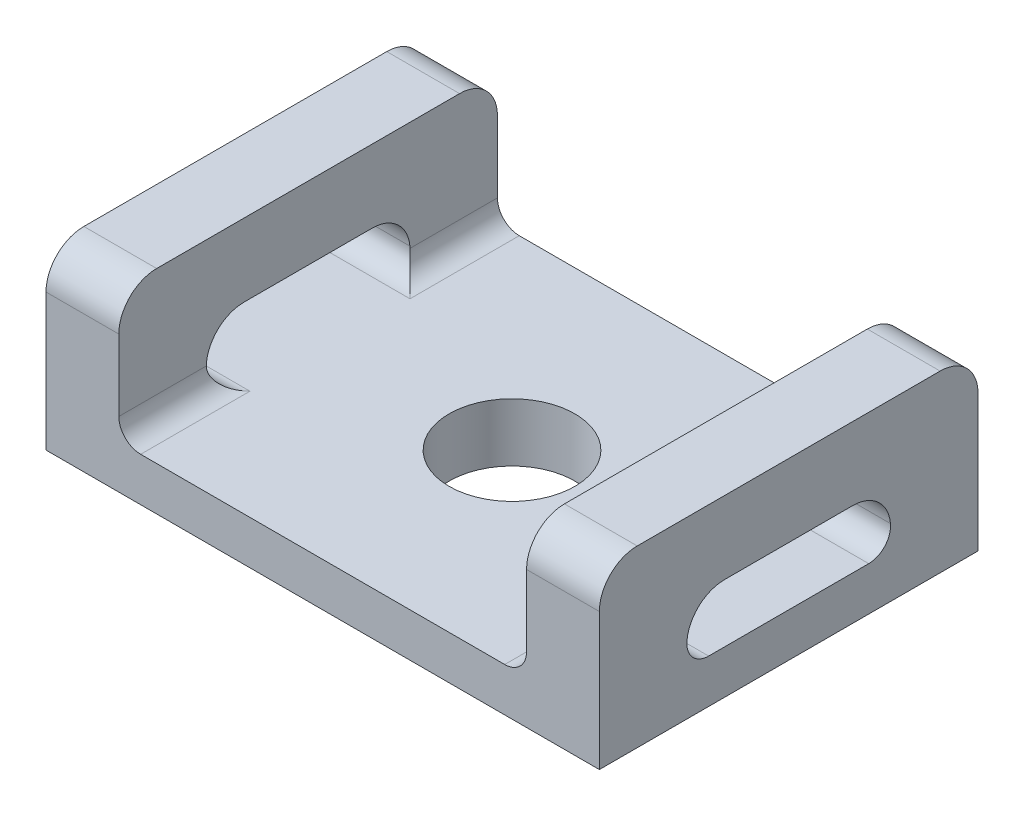
ISO-10303-21;
HEADER;
FILE_DESCRIPTION(('STEP AP214'),'2;1');
FILE_NAME('part.step','',(''),(''),'','','');
FILE_SCHEMA(('AUTOMOTIVE_DESIGN { 1 0 10303 214 1 1 1 1 }'));
ENDSEC;
DATA;
#1=APPLICATION_CONTEXT('core data for automotive mechanical design processes');
#2=APPLICATION_PROTOCOL_DEFINITION('international standard','automotive_design',2000,#1);
#3=PRODUCT_CONTEXT('',#1,'mechanical');
#4=PRODUCT('Part','Part','',(#3));
#5=PRODUCT_RELATED_PRODUCT_CATEGORY('part','',(#4));
#6=PRODUCT_DEFINITION_FORMATION('','',#4);
#7=PRODUCT_DEFINITION_CONTEXT('part definition',#1,'design');
#8=PRODUCT_DEFINITION('design','',#6,#7);
#9=PRODUCT_DEFINITION_SHAPE('','',#8);
#10=(LENGTH_UNIT() NAMED_UNIT(*) SI_UNIT(.MILLI.,.METRE.));
#11=(NAMED_UNIT(*) PLANE_ANGLE_UNIT() SI_UNIT($,.RADIAN.));
#12=(NAMED_UNIT(*) SI_UNIT($,.STERADIAN.) SOLID_ANGLE_UNIT());
#13=UNCERTAINTY_MEASURE_WITH_UNIT(LENGTH_MEASURE(1.E-05),#10,'distance_accuracy_value','');
#14=(GEOMETRIC_REPRESENTATION_CONTEXT(3) GLOBAL_UNCERTAINTY_ASSIGNED_CONTEXT((#13)) GLOBAL_UNIT_ASSIGNED_CONTEXT((#10,
#11,#12)) REPRESENTATION_CONTEXT('',''));
#15=CARTESIAN_POINT('',(0.,0.,0.));
#16=DIRECTION('',(0.,0.,1.));
#17=DIRECTION('',(1.,0.,0.));
#18=AXIS2_PLACEMENT_3D('',#15,#16,#17);
#19=CARTESIAN_POINT('',(-9.5,5.2,5.2));
#20=DIRECTION('',(1.,0.,0.));
#21=DIRECTION('',(0.,0.,-1.));
#22=AXIS2_PLACEMENT_3D('',#19,#20,#21);
#23=CYLINDRICAL_SURFACE('',#22,1.3);
#24=DIRECTION('',(1.,0.,0.));
#25=VECTOR('',#24,1.);
#26=CARTESIAN_POINT('',(-9.5,5.2,6.5));
#27=LINE('',#26,#25);
#28=CARTESIAN_POINT('',(-9.5,5.2,6.5));
#29=VERTEX_POINT('',#28);
#30=CARTESIAN_POINT('',(-7.,5.2,6.5));
#31=VERTEX_POINT('',#30);
#32=EDGE_CURVE('E298',#29,#31,#27,.T.);
#33=ORIENTED_EDGE('',*,*,#32,.T.);
#34=CARTESIAN_POINT('',(-7.,5.2,5.2));
#35=DIRECTION('',(-1.,0.,0.));
#36=DIRECTION('',(0.,-1.,0.));
#37=AXIS2_PLACEMENT_3D('',#34,#35,#36);
#38=CIRCLE('',#37,1.3);
#39=CARTESIAN_POINT('',(-7.,6.5,5.2));
#40=VERTEX_POINT('',#39);
#41=EDGE_CURVE('E516',#31,#40,#38,.T.);
#42=ORIENTED_EDGE('',*,*,#41,.T.);
#43=DIRECTION('',(1.,0.,0.));
#44=VECTOR('',#43,1.);
#45=CARTESIAN_POINT('',(-9.5,6.5,5.2));
#46=LINE('',#45,#44);
#47=CARTESIAN_POINT('',(-9.5,6.5,5.2));
#48=VERTEX_POINT('',#47);
#49=EDGE_CURVE('E312',#48,#40,#46,.T.);
#50=ORIENTED_EDGE('',*,*,#49,.F.);
#51=CARTESIAN_POINT('',(-9.5,5.2,5.2));
#52=DIRECTION('',(1.,0.,0.));
#53=DIRECTION('',(0.,0.,-1.));
#54=AXIS2_PLACEMENT_3D('',#51,#52,#53);
#55=CIRCLE('',#54,1.3);
#56=EDGE_CURVE('E503',#29,#48,#55,.F.);
#57=ORIENTED_EDGE('',*,*,#56,.F.);
#58=EDGE_LOOP('',(#33,#42,#50,#57));
#59=FACE_BOUND('',#58,.T.);
#60=ADVANCED_FACE('F49',(#59),#23,.T.);
#61=CARTESIAN_POINT('',(-9.5,6.5,0.));
#62=DIRECTION('',(0.,-1.,0.));
#63=DIRECTION('',(0.,0.,-1.));
#64=AXIS2_PLACEMENT_3D('',#61,#62,#63);
#65=PLANE('',#64);
#66=ORIENTED_EDGE('',*,*,#49,.T.);
#67=DIRECTION('',(0.,0.,-1.));
#68=VECTOR('',#67,1.);
#69=CARTESIAN_POINT('',(-7.,6.5,0.));
#70=LINE('',#69,#68);
#71=CARTESIAN_POINT('',(-7.,6.5,-5.2));
#72=VERTEX_POINT('',#71);
#73=EDGE_CURVE('E561',#40,#72,#70,.T.);
#74=ORIENTED_EDGE('',*,*,#73,.T.);
#75=DIRECTION('',(1.,0.,0.));
#76=VECTOR('',#75,1.);
#77=CARTESIAN_POINT('',(-9.5,6.5,-5.2));
#78=LINE('',#77,#76);
#79=CARTESIAN_POINT('',(-9.5,6.5,-5.2));
#80=VERTEX_POINT('',#79);
#81=EDGE_CURVE('E290',#80,#72,#78,.T.);
#82=ORIENTED_EDGE('',*,*,#81,.F.);
#83=DIRECTION('',(0.,0.,-1.));
#84=VECTOR('',#83,1.);
#85=CARTESIAN_POINT('',(-9.5,6.5,0.));
#86=LINE('',#85,#84);
#87=EDGE_CURVE('E506',#48,#80,#86,.T.);
#88=ORIENTED_EDGE('',*,*,#87,.F.);
#89=EDGE_LOOP('',(#66,#74,#82,#88));
#90=FACE_BOUND('',#89,.T.);
#91=ADVANCED_FACE('F655',(#90),#65,.F.);
#92=CARTESIAN_POINT('',(-9.5,5.2,-5.2));
#93=DIRECTION('',(1.,0.,0.));
#94=DIRECTION('',(0.,0.,-1.));
#95=AXIS2_PLACEMENT_3D('',#92,#93,#94);
#96=CYLINDRICAL_SURFACE('',#95,1.3);
#97=ORIENTED_EDGE('',*,*,#81,.T.);
#98=CARTESIAN_POINT('',(-7.,5.2,-5.2));
#99=DIRECTION('',(-1.,0.,0.));
#100=DIRECTION('',(0.,-1.,0.));
#101=AXIS2_PLACEMENT_3D('',#98,#99,#100);
#102=CIRCLE('',#101,1.3);
#103=CARTESIAN_POINT('',(-7.,5.2,-6.5));
#104=VERTEX_POINT('',#103);
#105=EDGE_CURVE('E564',#72,#104,#102,.T.);
#106=ORIENTED_EDGE('',*,*,#105,.T.);
#107=DIRECTION('',(1.,0.,0.));
#108=VECTOR('',#107,1.);
#109=CARTESIAN_POINT('',(-9.5,5.2,-6.5));
#110=LINE('',#109,#108);
#111=CARTESIAN_POINT('',(-9.5,5.2,-6.5));
#112=VERTEX_POINT('',#111);
#113=EDGE_CURVE('E279',#112,#104,#110,.T.);
#114=ORIENTED_EDGE('',*,*,#113,.F.);
#115=CARTESIAN_POINT('',(-9.5,5.2,-5.2));
#116=DIRECTION('',(1.,0.,0.));
#117=DIRECTION('',(0.,0.,-1.));
#118=AXIS2_PLACEMENT_3D('',#115,#116,#117);
#119=CIRCLE('',#118,1.3);
#120=EDGE_CURVE('E544',#80,#112,#119,.F.);
#121=ORIENTED_EDGE('',*,*,#120,.F.);
#122=EDGE_LOOP('',(#97,#106,#114,#121));
#123=FACE_BOUND('',#122,.T.);
#124=ADVANCED_FACE('F654',(#123),#96,.T.);
#125=CARTESIAN_POINT('',(-9.5,2.7,-2.2));
#126=DIRECTION('',(1.,0.,0.));
#127=DIRECTION('',(0.,0.,-1.));
#128=AXIS2_PLACEMENT_3D('',#125,#126,#127);
#129=CYLINDRICAL_SURFACE('',#128,1.3);
#130=CARTESIAN_POINT('',(-9.5,2.7,-2.2));
#131=DIRECTION('',(1.,0.,0.));
#132=DIRECTION('',(0.,0.,-1.));
#133=AXIS2_PLACEMENT_3D('',#130,#131,#132);
#134=CIRCLE('',#133,1.3);
#135=CARTESIAN_POINT('',(-9.5,2.81818181818182,-3.49461695410312));
#136=VERTEX_POINT('',#135);
#137=CARTESIAN_POINT('',(-9.5,4.,-2.2));
#138=VERTEX_POINT('',#137);
#139=EDGE_CURVE('E547',#136,#138,#134,.T.);
#140=ORIENTED_EDGE('',*,*,#139,.F.);
#141=DIRECTION('',(1.,0.,0.));
#142=VECTOR('',#141,1.);
#143=CARTESIAN_POINT('',(-9.5,2.81818181818182,-3.49461695410312));
#144=LINE('',#143,#142);
#145=CARTESIAN_POINT('',(-6.99999999999999,2.81818181818182,-3.49461695410312));
#146=VERTEX_POINT('',#145);
#147=EDGE_CURVE('E381',#136,#146,#144,.T.);
#148=ORIENTED_EDGE('',*,*,#147,.T.);
#149=CARTESIAN_POINT('',(-6.99999999999999,2.7,-2.2));
#150=DIRECTION('',(-1.,0.,0.));
#151=DIRECTION('',(0.,-1.,0.));
#152=AXIS2_PLACEMENT_3D('',#149,#150,#151);
#153=CIRCLE('',#152,1.3);
#154=CARTESIAN_POINT('',(-7.,4.,-2.2));
#155=VERTEX_POINT('',#154);
#156=EDGE_CURVE('E568',#146,#155,#153,.F.);
#157=ORIENTED_EDGE('',*,*,#156,.T.);
#158=DIRECTION('',(1.,0.,0.));
#159=VECTOR('',#158,1.);
#160=CARTESIAN_POINT('',(-9.5,4.,-2.2));
#161=LINE('',#160,#159);
#162=EDGE_CURVE('E280',#138,#155,#161,.T.);
#163=ORIENTED_EDGE('',*,*,#162,.F.);
#164=EDGE_LOOP('',(#140,#148,#157,#163));
#165=FACE_BOUND('',#164,.T.);
#166=ADVANCED_FACE('F686',(#165),#129,.F.);
#167=CARTESIAN_POINT('',(-9.5,4.,0.));
#168=DIRECTION('',(0.,-1.,0.));
#169=DIRECTION('',(0.,0.,-1.));
#170=AXIS2_PLACEMENT_3D('',#167,#168,#169);
#171=PLANE('',#170);
#172=DIRECTION('',(0.,0.,-1.));
#173=VECTOR('',#172,1.);
#174=CARTESIAN_POINT('',(-7.,4.,0.));
#175=LINE('',#174,#173);
#176=CARTESIAN_POINT('',(-6.99999999999999,4.,2.2));
#177=VERTEX_POINT('',#176);
#178=EDGE_CURVE('E571',#177,#155,#175,.T.);
#179=ORIENTED_EDGE('',*,*,#178,.F.);
#180=DIRECTION('',(1.,0.,0.));
#181=VECTOR('',#180,1.);
#182=CARTESIAN_POINT('',(-9.5,4.,2.2));
#183=LINE('',#182,#181);
#184=CARTESIAN_POINT('',(-9.5,4.,2.2));
#185=VERTEX_POINT('',#184);
#186=EDGE_CURVE('E293',#185,#177,#183,.T.);
#187=ORIENTED_EDGE('',*,*,#186,.F.);
#188=DIRECTION('',(0.,0.,-1.));
#189=VECTOR('',#188,1.);
#190=CARTESIAN_POINT('',(-9.5,4.,0.));
#191=LINE('',#190,#189);
#192=EDGE_CURVE('E550',#185,#138,#191,.T.);
#193=ORIENTED_EDGE('',*,*,#192,.T.);
#194=ORIENTED_EDGE('',*,*,#162,.T.);
#195=EDGE_LOOP('',(#179,#187,#193,#194));
#196=FACE_BOUND('',#195,.T.);
#197=ADVANCED_FACE('F675',(#196),#171,.T.);
#198=CARTESIAN_POINT('',(-9.5,2.7,2.2));
#199=DIRECTION('',(1.,0.,0.));
#200=DIRECTION('',(0.,0.,-1.));
#201=AXIS2_PLACEMENT_3D('',#198,#199,#200);
#202=CYLINDRICAL_SURFACE('',#201,1.3);
#203=CARTESIAN_POINT('',(-6.99999999999999,2.7,2.2));
#204=DIRECTION('',(-1.,0.,0.));
#205=DIRECTION('',(0.,-1.,0.));
#206=AXIS2_PLACEMENT_3D('',#203,#204,#205);
#207=CIRCLE('',#206,1.3);
#208=CARTESIAN_POINT('',(-6.99999999999999,2.81818181818182,3.49461695410312));
#209=VERTEX_POINT('',#208);
#210=EDGE_CURVE('E575',#177,#209,#207,.F.);
#211=ORIENTED_EDGE('',*,*,#210,.T.);
#212=DIRECTION('',(1.,0.,0.));
#213=VECTOR('',#212,1.);
#214=CARTESIAN_POINT('',(-9.5,2.81818181818182,3.49461695410312));
#215=LINE('',#214,#213);
#216=CARTESIAN_POINT('',(-9.5,2.81818181818182,3.49461695410312));
#217=VERTEX_POINT('',#216);
#218=EDGE_CURVE('E366',#209,#217,#215,.F.);
#219=ORIENTED_EDGE('',*,*,#218,.T.);
#220=CARTESIAN_POINT('',(-9.5,2.7,2.2));
#221=DIRECTION('',(1.,0.,0.));
#222=DIRECTION('',(0.,0.,-1.));
#223=AXIS2_PLACEMENT_3D('',#220,#221,#222);
#224=CIRCLE('',#223,1.3);
#225=EDGE_CURVE('E510',#185,#217,#224,.T.);
#226=ORIENTED_EDGE('',*,*,#225,.F.);
#227=ORIENTED_EDGE('',*,*,#186,.T.);
#228=EDGE_LOOP('',(#211,#219,#226,#227));
#229=FACE_BOUND('',#228,.T.);
#230=ADVANCED_FACE('F671',(#229),#202,.F.);
#231=CARTESIAN_POINT('',(0.,2.,0.));
#232=DIRECTION('',(0.,-1.,0.));
#233=DIRECTION('',(0.,0.,-1.));
#234=AXIS2_PLACEMENT_3D('',#231,#232,#233);
#235=PLANE('',#234);
#236=DIRECTION('',(-1.,0.,0.));
#237=VECTOR('',#236,1.);
#238=CARTESIAN_POINT('',(-6.99999999999999,2.,2.74772255750517));
#239=LINE('',#238,#237);
#240=CARTESIAN_POINT('',(-9.5,2.,2.74772255750517));
#241=VERTEX_POINT('',#240);
#242=CARTESIAN_POINT('',(-6.25,2.,2.74772255750517));
#243=VERTEX_POINT('',#242);
#244=EDGE_CURVE('E353',#241,#243,#239,.F.);
#245=ORIENTED_EDGE('',*,*,#244,.T.);
#246=DIRECTION('',(0.,0.,1.));
#247=VECTOR('',#246,1.);
#248=CARTESIAN_POINT('',(-6.25,2.,6.5));
#249=LINE('',#248,#247);
#250=CARTESIAN_POINT('',(-6.25,2.,6.5));
#251=VERTEX_POINT('',#250);
#252=EDGE_CURVE('E356',#243,#251,#249,.T.);
#253=ORIENTED_EDGE('',*,*,#252,.T.);
#254=DIRECTION('',(-1.,0.,0.));
#255=VECTOR('',#254,1.);
#256=CARTESIAN_POINT('',(-9.5,2.,6.5));
#257=LINE('',#256,#255);
#258=CARTESIAN_POINT('',(6.25,2.,6.5));
#259=VERTEX_POINT('',#258);
#260=EDGE_CURVE('E260',#259,#251,#257,.T.);
#261=ORIENTED_EDGE('',*,*,#260,.F.);
#262=DIRECTION('',(0.,0.,1.));
#263=VECTOR('',#262,1.);
#264=CARTESIAN_POINT('',(6.25,2.,3.5));
#265=LINE('',#264,#263);
#266=CARTESIAN_POINT('',(6.25,2.,2.74772255750517));
#267=VERTEX_POINT('',#266);
#268=EDGE_CURVE('E346',#259,#267,#265,.F.);
#269=ORIENTED_EDGE('',*,*,#268,.T.);
#270=DIRECTION('',(-1.,0.,0.));
#271=VECTOR('',#270,1.);
#272=CARTESIAN_POINT('',(9.5,2.,2.74772255750517));
#273=LINE('',#272,#271);
#274=CARTESIAN_POINT('',(9.5,2.,2.74772255750517));
#275=VERTEX_POINT('',#274);
#276=EDGE_CURVE('E349',#267,#275,#273,.F.);
#277=ORIENTED_EDGE('',*,*,#276,.T.);
#278=DIRECTION('',(0.,0.,-1.));
#279=VECTOR('',#278,1.);
#280=CARTESIAN_POINT('',(9.5,2.,6.5));
#281=LINE('',#280,#279);
#282=CARTESIAN_POINT('',(9.5,2.,-2.74772255750516));
#283=VERTEX_POINT('',#282);
#284=EDGE_CURVE('E307',#275,#283,#281,.T.);
#285=ORIENTED_EDGE('',*,*,#284,.T.);
#286=DIRECTION('',(-1.,0.,0.));
#287=VECTOR('',#286,1.);
#288=CARTESIAN_POINT('',(7.,2.,-2.74772255750516));
#289=LINE('',#288,#287);
#290=CARTESIAN_POINT('',(6.25,2.,-2.74772255750516));
#291=VERTEX_POINT('',#290);
#292=EDGE_CURVE('E340',#283,#291,#289,.T.);
#293=ORIENTED_EDGE('',*,*,#292,.T.);
#294=DIRECTION('',(0.,0.,1.));
#295=VECTOR('',#294,1.);
#296=CARTESIAN_POINT('',(6.25,2.,-6.5));
#297=LINE('',#296,#295);
#298=CARTESIAN_POINT('',(6.25,2.,-6.5));
#299=VERTEX_POINT('',#298);
#300=EDGE_CURVE('E343',#291,#299,#297,.F.);
#301=ORIENTED_EDGE('',*,*,#300,.T.);
#302=DIRECTION('',(1.,0.,0.));
#303=VECTOR('',#302,1.);
#304=CARTESIAN_POINT('',(-6.99999999999999,2.,-6.5));
#305=LINE('',#304,#303);
#306=CARTESIAN_POINT('',(-6.25,2.,-6.5));
#307=VERTEX_POINT('',#306);
#308=EDGE_CURVE('E261',#307,#299,#305,.T.);
#309=ORIENTED_EDGE('',*,*,#308,.F.);
#310=DIRECTION('',(0.,0.,1.));
#311=VECTOR('',#310,1.);
#312=CARTESIAN_POINT('',(-6.25,2.,-3.5));
#313=LINE('',#312,#311);
#314=CARTESIAN_POINT('',(-6.25,2.,-2.74772255750516));
#315=VERTEX_POINT('',#314);
#316=EDGE_CURVE('E336',#307,#315,#313,.T.);
#317=ORIENTED_EDGE('',*,*,#316,.T.);
#318=DIRECTION('',(-1.,0.,0.));
#319=VECTOR('',#318,1.);
#320=CARTESIAN_POINT('',(-9.5,2.,-2.74772255750516));
#321=LINE('',#320,#319);
#322=CARTESIAN_POINT('',(-9.5,2.,-2.74772255750516));
#323=VERTEX_POINT('',#322);
#324=EDGE_CURVE('E333',#315,#323,#321,.T.);
#325=ORIENTED_EDGE('',*,*,#324,.T.);
#326=DIRECTION('',(0.,0.,1.));
#327=VECTOR('',#326,1.);
#328=CARTESIAN_POINT('',(-9.5,2.,6.5));
#329=LINE('',#328,#327);
#330=EDGE_CURVE('E316',#323,#241,#329,.T.);
#331=ORIENTED_EDGE('',*,*,#330,.T.);
#332=EDGE_LOOP('',(#245,#253,#261,#269,#277,#285,#293,#301,#309,#317,#325,#331));
#333=FACE_BOUND('',#332,.T.);
#334=CARTESIAN_POINT('',(0.,2.,0.));
#335=DIRECTION('',(0.,1.,0.));
#336=DIRECTION('',(0.,0.,1.));
#337=AXIS2_PLACEMENT_3D('',#334,#335,#336);
#338=CIRCLE('',#337,2.159);
#339=CARTESIAN_POINT('',(0.,2.,2.159));
#340=VERTEX_POINT('',#339);
#341=EDGE_CURVE('E303',#340,#340,#338,.T.);
#342=ORIENTED_EDGE('',*,*,#341,.F.);
#343=EDGE_LOOP('',(#342));
#344=FACE_BOUND('',#343,.T.);
#345=ADVANCED_FACE('F615',(#333,#344),#235,.F.);
#346=CARTESIAN_POINT('',(0.,0.,0.));
#347=DIRECTION('',(0.,-1.,0.));
#348=DIRECTION('',(0.,0.,-1.));
#349=AXIS2_PLACEMENT_3D('',#346,#347,#348);
#350=PLANE('',#349);
#351=DIRECTION('',(1.,0.,0.));
#352=VECTOR('',#351,1.);
#353=CARTESIAN_POINT('',(9.5,0.,-6.));
#354=LINE('',#353,#352);
#355=CARTESIAN_POINT('',(-8.99999999999999,0.,-6.));
#356=VERTEX_POINT('',#355);
#357=CARTESIAN_POINT('',(9.,0.,-6.));
#358=VERTEX_POINT('',#357);
#359=EDGE_CURVE('E440',#356,#358,#354,.T.);
#360=ORIENTED_EDGE('',*,*,#359,.T.);
#361=DIRECTION('',(0.,0.,1.));
#362=VECTOR('',#361,1.);
#363=CARTESIAN_POINT('',(9.,0.,6.5));
#364=LINE('',#363,#362);
#365=CARTESIAN_POINT('',(9.,0.,6.));
#366=VERTEX_POINT('',#365);
#367=EDGE_CURVE('E449',#358,#366,#364,.T.);
#368=ORIENTED_EDGE('',*,*,#367,.T.);
#369=DIRECTION('',(-1.,0.,0.));
#370=VECTOR('',#369,1.);
#371=CARTESIAN_POINT('',(-9.5,0.,6.));
#372=LINE('',#371,#370);
#373=CARTESIAN_POINT('',(-8.99999999999999,0.,6.));
#374=VERTEX_POINT('',#373);
#375=EDGE_CURVE('E446',#366,#374,#372,.T.);
#376=ORIENTED_EDGE('',*,*,#375,.T.);
#377=DIRECTION('',(0.,0.,-1.));
#378=VECTOR('',#377,1.);
#379=CARTESIAN_POINT('',(-8.99999999999999,0.,-6.5));
#380=LINE('',#379,#378);
#381=EDGE_CURVE('E443',#374,#356,#380,.T.);
#382=ORIENTED_EDGE('',*,*,#381,.T.);
#383=EDGE_LOOP('',(#360,#368,#376,#382));
#384=FACE_BOUND('',#383,.T.);
#385=CARTESIAN_POINT('',(0.,0.,0.));
#386=DIRECTION('',(0.,1.,0.));
#387=DIRECTION('',(0.,0.,1.));
#388=AXIS2_PLACEMENT_3D('',#385,#386,#387);
#389=CIRCLE('',#388,2.159);
#390=CARTESIAN_POINT('',(0.,0.,2.159));
#391=VERTEX_POINT('',#390);
#392=EDGE_CURVE('E308',#391,#391,#389,.T.);
#393=ORIENTED_EDGE('',*,*,#392,.T.);
#394=EDGE_LOOP('',(#393));
#395=FACE_BOUND('',#394,.T.);
#396=ADVANCED_FACE('F480',(#384,#395),#350,.T.);
#397=CARTESIAN_POINT('',(9.5,2.,6.5));
#398=DIRECTION('',(-1.,0.,0.));
#399=DIRECTION('',(0.,0.,1.));
#400=AXIS2_PLACEMENT_3D('',#397,#398,#399);
#401=PLANE('',#400);
#402=CARTESIAN_POINT('',(9.5,2.7,-2.2));
#403=DIRECTION('',(1.,0.,0.));
#404=DIRECTION('',(0.,0.,-1.));
#405=AXIS2_PLACEMENT_3D('',#402,#403,#404);
#406=CIRCLE('',#405,1.3);
#407=CARTESIAN_POINT('',(9.5,2.81818181818182,-3.49461695410312));
#408=VERTEX_POINT('',#407);
#409=CARTESIAN_POINT('',(9.5,4.,-2.2));
#410=VERTEX_POINT('',#409);
#411=EDGE_CURVE('E528',#408,#410,#406,.T.);
#412=ORIENTED_EDGE('',*,*,#411,.F.);
#413=CARTESIAN_POINT('',(9.5,2.75,-2.74772255750516));
#414=DIRECTION('',(-1.,0.,0.));
#415=DIRECTION('',(0.,0.,1.));
#416=AXIS2_PLACEMENT_3D('',#413,#414,#415);
#417=CIRCLE('',#416,0.75);
#418=EDGE_CURVE('E404',#408,#283,#417,.T.);
#419=ORIENTED_EDGE('',*,*,#418,.T.);
#420=ORIENTED_EDGE('',*,*,#284,.F.);
#421=CARTESIAN_POINT('',(9.5,2.75,2.74772255750517));
#422=DIRECTION('',(-1.,0.,0.));
#423=DIRECTION('',(0.,0.,1.));
#424=AXIS2_PLACEMENT_3D('',#421,#422,#423);
#425=CIRCLE('',#424,0.75);
#426=CARTESIAN_POINT('',(9.5,2.81818181818182,3.49461695410312));
#427=VERTEX_POINT('',#426);
#428=EDGE_CURVE('E393',#275,#427,#425,.T.);
#429=ORIENTED_EDGE('',*,*,#428,.T.);
#430=CARTESIAN_POINT('',(9.5,2.7,2.2));
#431=DIRECTION('',(1.,0.,0.));
#432=DIRECTION('',(0.,0.,-1.));
#433=AXIS2_PLACEMENT_3D('',#430,#431,#432);
#434=CIRCLE('',#433,1.3);
#435=CARTESIAN_POINT('',(9.5,4.,2.2));
#436=VERTEX_POINT('',#435);
#437=EDGE_CURVE('E535',#436,#427,#434,.T.);
#438=ORIENTED_EDGE('',*,*,#437,.F.);
#439=DIRECTION('',(0.,0.,-1.));
#440=VECTOR('',#439,1.);
#441=CARTESIAN_POINT('',(9.5,4.,0.));
#442=LINE('',#441,#440);
#443=EDGE_CURVE('E531',#436,#410,#442,.T.);
#444=ORIENTED_EDGE('',*,*,#443,.T.);
#445=EDGE_LOOP('',(#412,#419,#420,#429,#438,#444));
#446=FACE_BOUND('',#445,.T.);
#447=DIRECTION('',(0.,-1.,0.));
#448=VECTOR('',#447,1.);
#449=CARTESIAN_POINT('',(9.5,2.,6.5));
#450=LINE('',#449,#448);
#451=CARTESIAN_POINT('',(9.5,5.2,6.5));
#452=VERTEX_POINT('',#451);
#453=CARTESIAN_POINT('',(9.5,0.500000000000004,6.5));
#454=VERTEX_POINT('',#453);
#455=EDGE_CURVE('E320',#452,#454,#450,.T.);
#456=ORIENTED_EDGE('',*,*,#455,.T.);
#457=DIRECTION('',(0.,0.,-1.));
#458=VECTOR('',#457,1.);
#459=CARTESIAN_POINT('',(9.5,0.500000000000004,-6.5));
#460=LINE('',#459,#458);
#461=CARTESIAN_POINT('',(9.5,0.500000000000004,-6.5));
#462=VERTEX_POINT('',#461);
#463=EDGE_CURVE('E420',#454,#462,#460,.T.);
#464=ORIENTED_EDGE('',*,*,#463,.T.);
#465=DIRECTION('',(0.,-1.,0.));
#466=VECTOR('',#465,1.);
#467=CARTESIAN_POINT('',(9.5,2.,-6.5));
#468=LINE('',#467,#466);
#469=CARTESIAN_POINT('',(9.5,5.2,-6.5));
#470=VERTEX_POINT('',#469);
#471=EDGE_CURVE('E330',#470,#462,#468,.T.);
#472=ORIENTED_EDGE('',*,*,#471,.F.);
#473=CARTESIAN_POINT('',(9.5,5.2,-5.2));
#474=DIRECTION('',(1.,0.,0.));
#475=DIRECTION('',(0.,0.,-1.));
#476=AXIS2_PLACEMENT_3D('',#473,#474,#475);
#477=CIRCLE('',#476,1.3);
#478=CARTESIAN_POINT('',(9.5,6.5,-5.2));
#479=VERTEX_POINT('',#478);
#480=EDGE_CURVE('E277',#479,#470,#477,.F.);
#481=ORIENTED_EDGE('',*,*,#480,.F.);
#482=DIRECTION('',(0.,0.,-1.));
#483=VECTOR('',#482,1.);
#484=CARTESIAN_POINT('',(9.5,6.5,0.));
#485=LINE('',#484,#483);
#486=CARTESIAN_POINT('',(9.5,6.5,5.2));
#487=VERTEX_POINT('',#486);
#488=EDGE_CURVE('E511',#487,#479,#485,.T.);
#489=ORIENTED_EDGE('',*,*,#488,.F.);
#490=CARTESIAN_POINT('',(9.5,5.2,5.2));
#491=DIRECTION('',(1.,0.,0.));
#492=DIRECTION('',(0.,0.,-1.));
#493=AXIS2_PLACEMENT_3D('',#490,#491,#492);
#494=CIRCLE('',#493,1.3);
#495=EDGE_CURVE('E494',#452,#487,#494,.F.);
#496=ORIENTED_EDGE('',*,*,#495,.F.);
#497=EDGE_LOOP('',(#456,#464,#472,#481,#489,#496));
#498=FACE_BOUND('',#497,.T.);
#499=ADVANCED_FACE('F489',(#446,#498),#401,.F.);
#500=CARTESIAN_POINT('',(-9.5,2.,-6.5));
#501=DIRECTION('',(0.,0.,1.));
#502=DIRECTION('',(1.,0.,0.));
#503=AXIS2_PLACEMENT_3D('',#500,#501,#502);
#504=PLANE('',#503);
#505=ORIENTED_EDGE('',*,*,#471,.T.);
#506=DIRECTION('',(-1.,0.,0.));
#507=VECTOR('',#506,1.);
#508=CARTESIAN_POINT('',(-9.5,0.500000000000004,-6.5));
#509=LINE('',#508,#507);
#510=CARTESIAN_POINT('',(-9.5,0.500000000000004,-6.5));
#511=VERTEX_POINT('',#510);
#512=EDGE_CURVE('E11',#462,#511,#509,.T.);
#513=ORIENTED_EDGE('',*,*,#512,.T.);
#514=DIRECTION('',(0.,-1.,0.));
#515=VECTOR('',#514,1.);
#516=CARTESIAN_POINT('',(-9.5,2.,-6.5));
#517=LINE('',#516,#515);
#518=EDGE_CURVE('E327',#112,#511,#517,.T.);
#519=ORIENTED_EDGE('',*,*,#518,.F.);
#520=ORIENTED_EDGE('',*,*,#113,.T.);
#521=DIRECTION('',(0.,-1.,0.));
#522=VECTOR('',#521,1.);
#523=CARTESIAN_POINT('',(-7.,7.,-6.5));
#524=LINE('',#523,#522);
#525=CARTESIAN_POINT('',(-6.99999999999999,2.75,-6.5));
#526=VERTEX_POINT('',#525);
#527=EDGE_CURVE('E425',#104,#526,#524,.T.);
#528=ORIENTED_EDGE('',*,*,#527,.T.);
#529=CARTESIAN_POINT('',(-6.25,2.75,-6.5));
#530=DIRECTION('',(0.,0.,1.));
#531=DIRECTION('',(1.,0.,0.));
#532=AXIS2_PLACEMENT_3D('',#529,#530,#531);
#533=CIRCLE('',#532,0.75);
#534=EDGE_CURVE('E410',#526,#307,#533,.T.);
#535=ORIENTED_EDGE('',*,*,#534,.T.);
#536=ORIENTED_EDGE('',*,*,#308,.T.);
#537=CARTESIAN_POINT('',(6.25,2.75,-6.5));
#538=DIRECTION('',(0.,0.,1.));
#539=DIRECTION('',(1.,0.,0.));
#540=AXIS2_PLACEMENT_3D('',#537,#538,#539);
#541=CIRCLE('',#540,0.75);
#542=CARTESIAN_POINT('',(7.,2.75,-6.5));
#543=VERTEX_POINT('',#542);
#544=EDGE_CURVE('E256',#299,#543,#541,.T.);
#545=ORIENTED_EDGE('',*,*,#544,.T.);
#546=DIRECTION('',(0.,1.,0.));
#547=VECTOR('',#546,1.);
#548=CARTESIAN_POINT('',(7.,7.,-6.5));
#549=LINE('',#548,#547);
#550=CARTESIAN_POINT('',(7.,5.2,-6.5));
#551=VERTEX_POINT('',#550);
#552=EDGE_CURVE('E248',#543,#551,#549,.T.);
#553=ORIENTED_EDGE('',*,*,#552,.T.);
#554=EDGE_CURVE('E252',#551,#470,#110,.T.);
#555=ORIENTED_EDGE('',*,*,#554,.T.);
#556=EDGE_LOOP('',(#505,#513,#519,#520,#528,#535,#536,#545,#553,#555));
#557=FACE_BOUND('',#556,.T.);
#558=ADVANCED_FACE('F250',(#557),#504,.F.);
#559=CARTESIAN_POINT('',(-9.5,2.,6.5));
#560=DIRECTION('',(1.,0.,0.));
#561=DIRECTION('',(0.,0.,-1.));
#562=AXIS2_PLACEMENT_3D('',#559,#560,#561);
#563=PLANE('',#562);
#564=ORIENTED_EDGE('',*,*,#330,.F.);
#565=CARTESIAN_POINT('',(-9.5,2.75,-2.74772255750516));
#566=DIRECTION('',(1.,0.,0.));
#567=DIRECTION('',(0.,0.,-1.));
#568=AXIS2_PLACEMENT_3D('',#565,#566,#567);
#569=CIRCLE('',#568,0.75);
#570=EDGE_CURVE('E417',#323,#136,#569,.T.);
#571=ORIENTED_EDGE('',*,*,#570,.T.);
#572=ORIENTED_EDGE('',*,*,#139,.T.);
#573=ORIENTED_EDGE('',*,*,#192,.F.);
#574=ORIENTED_EDGE('',*,*,#225,.T.);
#575=CARTESIAN_POINT('',(-9.5,2.75,2.74772255750517));
#576=DIRECTION('',(1.,0.,0.));
#577=DIRECTION('',(0.,0.,-1.));
#578=AXIS2_PLACEMENT_3D('',#575,#576,#577);
#579=CIRCLE('',#578,0.75);
#580=EDGE_CURVE('E390',#217,#241,#579,.T.);
#581=ORIENTED_EDGE('',*,*,#580,.T.);
#582=EDGE_LOOP('',(#564,#571,#572,#573,#574,#581));
#583=FACE_BOUND('',#582,.T.);
#584=ORIENTED_EDGE('',*,*,#518,.T.);
#585=DIRECTION('',(0.,0.,1.));
#586=VECTOR('',#585,1.);
#587=CARTESIAN_POINT('',(-9.5,0.500000000000004,6.5));
#588=LINE('',#587,#586);
#589=CARTESIAN_POINT('',(-9.5,0.500000000000004,6.5));
#590=VERTEX_POINT('',#589);
#591=EDGE_CURVE('E60',#511,#590,#588,.T.);
#592=ORIENTED_EDGE('',*,*,#591,.T.);
#593=DIRECTION('',(0.,-1.,0.));
#594=VECTOR('',#593,1.);
#595=CARTESIAN_POINT('',(-9.5,2.,6.5));
#596=LINE('',#595,#594);
#597=EDGE_CURVE('E324',#29,#590,#596,.T.);
#598=ORIENTED_EDGE('',*,*,#597,.F.);
#599=ORIENTED_EDGE('',*,*,#56,.T.);
#600=ORIENTED_EDGE('',*,*,#87,.T.);
#601=ORIENTED_EDGE('',*,*,#120,.T.);
#602=EDGE_LOOP('',(#584,#592,#598,#599,#600,#601));
#603=FACE_BOUND('',#602,.T.);
#604=ADVANCED_FACE('F502',(#583,#603),#563,.F.);
#605=CARTESIAN_POINT('',(-9.5,2.,6.5));
#606=DIRECTION('',(0.,0.,-1.));
#607=DIRECTION('',(-1.,0.,0.));
#608=AXIS2_PLACEMENT_3D('',#605,#606,#607);
#609=PLANE('',#608);
#610=ORIENTED_EDGE('',*,*,#597,.T.);
#611=DIRECTION('',(1.,0.,0.));
#612=VECTOR('',#611,1.);
#613=CARTESIAN_POINT('',(9.5,0.500000000000004,6.5));
#614=LINE('',#613,#612);
#615=EDGE_CURVE('E453',#590,#454,#614,.T.);
#616=ORIENTED_EDGE('',*,*,#615,.T.);
#617=ORIENTED_EDGE('',*,*,#455,.F.);
#618=CARTESIAN_POINT('',(7.,5.2,6.5));
#619=VERTEX_POINT('',#618);
#620=EDGE_CURVE('E302',#619,#452,#27,.T.);
#621=ORIENTED_EDGE('',*,*,#620,.F.);
#622=DIRECTION('',(0.,-1.,0.));
#623=VECTOR('',#622,1.);
#624=CARTESIAN_POINT('',(7.,2.,6.5));
#625=LINE('',#624,#623);
#626=CARTESIAN_POINT('',(7.,2.75,6.5));
#627=VERTEX_POINT('',#626);
#628=EDGE_CURVE('E579',#619,#627,#625,.T.);
#629=ORIENTED_EDGE('',*,*,#628,.T.);
#630=CARTESIAN_POINT('',(6.25,2.75,6.5));
#631=DIRECTION('',(0.,0.,-1.));
#632=DIRECTION('',(-1.,0.,0.));
#633=AXIS2_PLACEMENT_3D('',#630,#631,#632);
#634=CIRCLE('',#633,0.75);
#635=EDGE_CURVE('E399',#627,#259,#634,.T.);
#636=ORIENTED_EDGE('',*,*,#635,.T.);
#637=ORIENTED_EDGE('',*,*,#260,.T.);
#638=CARTESIAN_POINT('',(-6.25,2.75,6.5));
#639=DIRECTION('',(0.,0.,-1.));
#640=DIRECTION('',(-1.,0.,0.));
#641=AXIS2_PLACEMENT_3D('',#638,#639,#640);
#642=CIRCLE('',#641,0.75);
#643=CARTESIAN_POINT('',(-6.99999999999999,2.75,6.5));
#644=VERTEX_POINT('',#643);
#645=EDGE_CURVE('E384',#251,#644,#642,.T.);
#646=ORIENTED_EDGE('',*,*,#645,.T.);
#647=DIRECTION('',(0.,1.,0.));
#648=VECTOR('',#647,1.);
#649=CARTESIAN_POINT('',(-6.99999999999999,2.,6.5));
#650=LINE('',#649,#648);
#651=EDGE_CURVE('E541',#644,#31,#650,.T.);
#652=ORIENTED_EDGE('',*,*,#651,.T.);
#653=ORIENTED_EDGE('',*,*,#32,.F.);
#654=EDGE_LOOP('',(#610,#616,#617,#621,#629,#636,#637,#646,#652,#653));
#655=FACE_BOUND('',#654,.T.);
#656=ADVANCED_FACE('F497',(#655),#609,.F.);
#657=CARTESIAN_POINT('',(0.,2.,0.));
#658=DIRECTION('',(0.,-1.,0.));
#659=DIRECTION('',(0.,0.,-1.));
#660=AXIS2_PLACEMENT_3D('',#657,#658,#659);
#661=CYLINDRICAL_SURFACE('',#660,2.159);
#662=ORIENTED_EDGE('',*,*,#341,.T.);
#663=EDGE_LOOP('',(#662));
#664=FACE_BOUND('',#663,.T.);
#665=ORIENTED_EDGE('',*,*,#392,.F.);
#666=EDGE_LOOP('',(#665));
#667=FACE_BOUND('',#666,.T.);
#668=ADVANCED_FACE('F705',(#664,#667),#661,.F.);
#669=CARTESIAN_POINT('',(7.,6.5,5.2));
#670=VERTEX_POINT('',#669);
#671=EDGE_CURVE('E520',#670,#487,#46,.T.);
#672=ORIENTED_EDGE('',*,*,#671,.F.);
#673=CARTESIAN_POINT('',(7.,5.2,5.2));
#674=DIRECTION('',(1.,0.,0.));
#675=DIRECTION('',(0.,0.,-1.));
#676=AXIS2_PLACEMENT_3D('',#673,#674,#675);
#677=CIRCLE('',#676,1.3);
#678=EDGE_CURVE('E582',#670,#619,#677,.T.);
#679=ORIENTED_EDGE('',*,*,#678,.T.);
#680=ORIENTED_EDGE('',*,*,#620,.T.);
#681=ORIENTED_EDGE('',*,*,#495,.T.);
#682=EDGE_LOOP('',(#672,#679,#680,#681));
#683=FACE_BOUND('',#682,.T.);
#684=ADVANCED_FACE('F646',(#683),#23,.T.);
#685=CARTESIAN_POINT('',(7.,6.5,-5.2));
#686=VERTEX_POINT('',#685);
#687=EDGE_CURVE('E285',#686,#479,#78,.T.);
#688=ORIENTED_EDGE('',*,*,#687,.F.);
#689=DIRECTION('',(0.,0.,1.));
#690=VECTOR('',#689,1.);
#691=CARTESIAN_POINT('',(7.,6.5,0.));
#692=LINE('',#691,#690);
#693=EDGE_CURVE('E268',#686,#670,#692,.T.);
#694=ORIENTED_EDGE('',*,*,#693,.T.);
#695=ORIENTED_EDGE('',*,*,#671,.T.);
#696=ORIENTED_EDGE('',*,*,#488,.T.);
#697=EDGE_LOOP('',(#688,#694,#695,#696));
#698=FACE_BOUND('',#697,.T.);
#699=ADVANCED_FACE('F648',(#698),#65,.F.);
#700=ORIENTED_EDGE('',*,*,#554,.F.);
#701=CARTESIAN_POINT('',(7.,5.2,-5.2));
#702=DIRECTION('',(1.,0.,0.));
#703=DIRECTION('',(0.,0.,-1.));
#704=AXIS2_PLACEMENT_3D('',#701,#702,#703);
#705=CIRCLE('',#704,1.3);
#706=EDGE_CURVE('E264',#551,#686,#705,.T.);
#707=ORIENTED_EDGE('',*,*,#706,.T.);
#708=ORIENTED_EDGE('',*,*,#687,.T.);
#709=ORIENTED_EDGE('',*,*,#480,.T.);
#710=EDGE_LOOP('',(#700,#707,#708,#709));
#711=FACE_BOUND('',#710,.T.);
#712=ADVANCED_FACE('F275',(#711),#96,.T.);
#713=CARTESIAN_POINT('',(7.,2.7,-2.2));
#714=DIRECTION('',(1.,0.,0.));
#715=DIRECTION('',(0.,0.,-1.));
#716=AXIS2_PLACEMENT_3D('',#713,#714,#715);
#717=CIRCLE('',#716,1.3);
#718=CARTESIAN_POINT('',(7.,4.,-2.2));
#719=VERTEX_POINT('',#718);
#720=CARTESIAN_POINT('',(7.,2.81818181818182,-3.49461695410312));
#721=VERTEX_POINT('',#720);
#722=EDGE_CURVE('E272',#719,#721,#717,.F.);
#723=ORIENTED_EDGE('',*,*,#722,.T.);
#724=DIRECTION('',(1.,0.,0.));
#725=VECTOR('',#724,1.);
#726=CARTESIAN_POINT('',(-9.5,2.81818181818182,-3.49461695410312));
#727=LINE('',#726,#725);
#728=EDGE_CURVE('E378',#721,#408,#727,.T.);
#729=ORIENTED_EDGE('',*,*,#728,.T.);
#730=ORIENTED_EDGE('',*,*,#411,.T.);
#731=EDGE_CURVE('E287',#719,#410,#161,.T.);
#732=ORIENTED_EDGE('',*,*,#731,.F.);
#733=EDGE_LOOP('',(#723,#729,#730,#732));
#734=FACE_BOUND('',#733,.T.);
#735=ADVANCED_FACE('F630',(#734),#129,.F.);
#736=DIRECTION('',(0.,0.,1.));
#737=VECTOR('',#736,1.);
#738=CARTESIAN_POINT('',(7.,4.,0.));
#739=LINE('',#738,#737);
#740=CARTESIAN_POINT('',(7.,4.,2.2));
#741=VERTEX_POINT('',#740);
#742=EDGE_CURVE('E591',#719,#741,#739,.T.);
#743=ORIENTED_EDGE('',*,*,#742,.F.);
#744=ORIENTED_EDGE('',*,*,#731,.T.);
#745=ORIENTED_EDGE('',*,*,#443,.F.);
#746=EDGE_CURVE('E297',#741,#436,#183,.T.);
#747=ORIENTED_EDGE('',*,*,#746,.F.);
#748=EDGE_LOOP('',(#743,#744,#745,#747));
#749=FACE_BOUND('',#748,.T.);
#750=ADVANCED_FACE('F640',(#749),#171,.T.);
#751=ORIENTED_EDGE('',*,*,#437,.T.);
#752=DIRECTION('',(1.,0.,0.));
#753=VECTOR('',#752,1.);
#754=CARTESIAN_POINT('',(-9.5,2.81818181818182,3.49461695410312));
#755=LINE('',#754,#753);
#756=CARTESIAN_POINT('',(7.,2.81818181818182,3.49461695410312));
#757=VERTEX_POINT('',#756);
#758=EDGE_CURVE('E369',#427,#757,#755,.F.);
#759=ORIENTED_EDGE('',*,*,#758,.T.);
#760=CARTESIAN_POINT('',(7.,2.7,2.2));
#761=DIRECTION('',(1.,0.,0.));
#762=DIRECTION('',(0.,0.,-1.));
#763=AXIS2_PLACEMENT_3D('',#760,#761,#762);
#764=CIRCLE('',#763,1.3);
#765=EDGE_CURVE('E595',#757,#741,#764,.F.);
#766=ORIENTED_EDGE('',*,*,#765,.T.);
#767=ORIENTED_EDGE('',*,*,#746,.T.);
#768=EDGE_LOOP('',(#751,#759,#766,#767));
#769=FACE_BOUND('',#768,.T.);
#770=ADVANCED_FACE('F811',(#769),#202,.F.);
#771=CARTESIAN_POINT('',(-7.,7.,-6.5));
#772=DIRECTION('',(-1.,0.,0.));
#773=DIRECTION('',(0.,-1.,0.));
#774=AXIS2_PLACEMENT_3D('',#771,#772,#773);
#775=PLANE('',#774);
#776=ORIENTED_EDGE('',*,*,#651,.F.);
#777=DIRECTION('',(0.,0.,1.));
#778=VECTOR('',#777,1.);
#779=CARTESIAN_POINT('',(-6.99999999999999,2.75,3.5));
#780=LINE('',#779,#778);
#781=CARTESIAN_POINT('',(-6.99999999999999,2.75,3.49772255750517));
#782=VERTEX_POINT('',#781);
#783=EDGE_CURVE('E363',#644,#782,#780,.F.);
#784=ORIENTED_EDGE('',*,*,#783,.T.);
#785=CARTESIAN_POINT('',(-6.99999999999999,2.75,2.74772255750517));
#786=DIRECTION('',(-1.,0.,0.));
#787=DIRECTION('',(0.,-1.,0.));
#788=AXIS2_PLACEMENT_3D('',#785,#786,#787);
#789=CIRCLE('',#788,0.75);
#790=EDGE_CURVE('E387',#782,#209,#789,.T.);
#791=ORIENTED_EDGE('',*,*,#790,.T.);
#792=ORIENTED_EDGE('',*,*,#210,.F.);
#793=ORIENTED_EDGE('',*,*,#178,.T.);
#794=ORIENTED_EDGE('',*,*,#156,.F.);
#795=CARTESIAN_POINT('',(-6.99999999999999,2.75,-2.74772255750516));
#796=DIRECTION('',(-1.,0.,0.));
#797=DIRECTION('',(0.,-1.,0.));
#798=AXIS2_PLACEMENT_3D('',#795,#796,#797);
#799=CIRCLE('',#798,0.75);
#800=CARTESIAN_POINT('',(-6.99999999999999,2.75,-3.49772255750516));
#801=VERTEX_POINT('',#800);
#802=EDGE_CURVE('E413',#146,#801,#799,.T.);
#803=ORIENTED_EDGE('',*,*,#802,.T.);
#804=DIRECTION('',(0.,0.,1.));
#805=VECTOR('',#804,1.);
#806=CARTESIAN_POINT('',(-6.99999999999999,2.75,-6.5));
#807=LINE('',#806,#805);
#808=EDGE_CURVE('E360',#801,#526,#807,.F.);
#809=ORIENTED_EDGE('',*,*,#808,.T.);
#810=ORIENTED_EDGE('',*,*,#527,.F.);
#811=ORIENTED_EDGE('',*,*,#105,.F.);
#812=ORIENTED_EDGE('',*,*,#73,.F.);
#813=ORIENTED_EDGE('',*,*,#41,.F.);
#814=EDGE_LOOP('',(#776,#784,#791,#792,#793,#794,#803,#809,#810,#811,#812,#813));
#815=FACE_BOUND('',#814,.T.);
#816=ADVANCED_FACE('F657',(#815),#775,.F.);
#817=CARTESIAN_POINT('',(7.,7.,-6.5));
#818=DIRECTION('',(1.,0.,0.));
#819=DIRECTION('',(0.,0.,-1.));
#820=AXIS2_PLACEMENT_3D('',#817,#818,#819);
#821=PLANE('',#820);
#822=CARTESIAN_POINT('',(7.,2.75,2.74772255750517));
#823=DIRECTION('',(1.,0.,0.));
#824=DIRECTION('',(0.,0.,-1.));
#825=AXIS2_PLACEMENT_3D('',#822,#823,#824);
#826=CIRCLE('',#825,0.75);
#827=CARTESIAN_POINT('',(7.,2.75,3.49772255750517));
#828=VERTEX_POINT('',#827);
#829=EDGE_CURVE('E396',#757,#828,#826,.T.);
#830=ORIENTED_EDGE('',*,*,#829,.T.);
#831=DIRECTION('',(0.,0.,1.));
#832=VECTOR('',#831,1.);
#833=CARTESIAN_POINT('',(7.,2.75,6.5));
#834=LINE('',#833,#832);
#835=EDGE_CURVE('E375',#828,#627,#834,.T.);
#836=ORIENTED_EDGE('',*,*,#835,.T.);
#837=ORIENTED_EDGE('',*,*,#628,.F.);
#838=ORIENTED_EDGE('',*,*,#678,.F.);
#839=ORIENTED_EDGE('',*,*,#693,.F.);
#840=ORIENTED_EDGE('',*,*,#706,.F.);
#841=ORIENTED_EDGE('',*,*,#552,.F.);
#842=DIRECTION('',(0.,0.,1.));
#843=VECTOR('',#842,1.);
#844=CARTESIAN_POINT('',(7.,2.75,-3.5));
#845=LINE('',#844,#843);
#846=CARTESIAN_POINT('',(7.,2.75,-3.49772255750516));
#847=VERTEX_POINT('',#846);
#848=EDGE_CURVE('E372',#543,#847,#845,.T.);
#849=ORIENTED_EDGE('',*,*,#848,.T.);
#850=CARTESIAN_POINT('',(7.,2.75,-2.74772255750516));
#851=DIRECTION('',(1.,0.,0.));
#852=DIRECTION('',(0.,0.,-1.));
#853=AXIS2_PLACEMENT_3D('',#850,#851,#852);
#854=CIRCLE('',#853,0.75);
#855=EDGE_CURVE('E407',#847,#721,#854,.T.);
#856=ORIENTED_EDGE('',*,*,#855,.T.);
#857=ORIENTED_EDGE('',*,*,#722,.F.);
#858=ORIENTED_EDGE('',*,*,#742,.T.);
#859=ORIENTED_EDGE('',*,*,#765,.F.);
#860=EDGE_LOOP('',(#830,#836,#837,#838,#839,#840,#841,#849,#856,#857,#858,#859));
#861=FACE_BOUND('',#860,.T.);
#862=ADVANCED_FACE('F266',(#861),#821,.F.);
#863=CARTESIAN_POINT('',(-9.5,2.75,2.74772255750517));
#864=DIRECTION('',(1.,0.,0.));
#865=DIRECTION('',(0.,0.,-1.));
#866=AXIS2_PLACEMENT_3D('',#863,#864,#865);
#867=CYLINDRICAL_SURFACE('',#866,0.75);
#868=ORIENTED_EDGE('',*,*,#218,.F.);
#869=ORIENTED_EDGE('',*,*,#790,.F.);
#870=CARTESIAN_POINT('',(-6.25,2.75,2.74772255750517));
#871=DIRECTION('',(0.707106781186547,0.,0.707106781186547));
#872=DIRECTION('',(0.707106781186547,0.,-0.707106781186547));
#873=AXIS2_PLACEMENT_3D('',#870,#871,#872);
#874=ELLIPSE('',#873,1.06066017177982,0.75);
#875=EDGE_CURVE('E421',#243,#782,#874,.F.);
#876=ORIENTED_EDGE('',*,*,#875,.F.);
#877=ORIENTED_EDGE('',*,*,#244,.F.);
#878=ORIENTED_EDGE('',*,*,#580,.F.);
#879=EDGE_LOOP('',(#868,#869,#876,#877,#878));
#880=FACE_BOUND('',#879,.T.);
#881=ADVANCED_FACE('F667',(#880),#867,.F.);
#882=CARTESIAN_POINT('',(-6.25,2.75,0.));
#883=DIRECTION('',(0.,0.,-1.));
#884=DIRECTION('',(-1.,0.,0.));
#885=AXIS2_PLACEMENT_3D('',#882,#883,#884);
#886=CYLINDRICAL_SURFACE('',#885,0.75);
#887=ORIENTED_EDGE('',*,*,#875,.T.);
#888=ORIENTED_EDGE('',*,*,#783,.F.);
#889=ORIENTED_EDGE('',*,*,#645,.F.);
#890=ORIENTED_EDGE('',*,*,#252,.F.);
#891=EDGE_LOOP('',(#887,#888,#889,#890));
#892=FACE_BOUND('',#891,.T.);
#893=ADVANCED_FACE('F661',(#892),#886,.F.);
#894=CARTESIAN_POINT('',(6.25,2.75,-6.5));
#895=DIRECTION('',(0.,0.,-1.));
#896=DIRECTION('',(-1.,0.,0.));
#897=AXIS2_PLACEMENT_3D('',#894,#895,#896);
#898=CYLINDRICAL_SURFACE('',#897,0.75);
#899=ORIENTED_EDGE('',*,*,#835,.F.);
#900=CARTESIAN_POINT('',(6.25,2.75,2.74772255750517));
#901=DIRECTION('',(0.707106781186547,0.,-0.707106781186547));
#902=DIRECTION('',(-0.707106781186547,0.,-0.707106781186547));
#903=AXIS2_PLACEMENT_3D('',#900,#901,#902);
#904=ELLIPSE('',#903,1.06066017177982,0.75);
#905=EDGE_CURVE('E426',#267,#828,#904,.F.);
#906=ORIENTED_EDGE('',*,*,#905,.F.);
#907=ORIENTED_EDGE('',*,*,#268,.F.);
#908=ORIENTED_EDGE('',*,*,#635,.F.);
#909=EDGE_LOOP('',(#899,#906,#907,#908));
#910=FACE_BOUND('',#909,.T.);
#911=ADVANCED_FACE('F729',(#910),#898,.F.);
#912=CARTESIAN_POINT('',(-9.5,2.75,2.74772255750517));
#913=DIRECTION('',(1.,0.,0.));
#914=DIRECTION('',(0.,0.,-1.));
#915=AXIS2_PLACEMENT_3D('',#912,#913,#914);
#916=CYLINDRICAL_SURFACE('',#915,0.75);
#917=ORIENTED_EDGE('',*,*,#829,.F.);
#918=ORIENTED_EDGE('',*,*,#758,.F.);
#919=ORIENTED_EDGE('',*,*,#428,.F.);
#920=ORIENTED_EDGE('',*,*,#276,.F.);
#921=ORIENTED_EDGE('',*,*,#905,.T.);
#922=EDGE_LOOP('',(#917,#918,#919,#920,#921));
#923=FACE_BOUND('',#922,.T.);
#924=ADVANCED_FACE('F732',(#923),#916,.F.);
#925=CARTESIAN_POINT('',(-9.5,2.75,-2.74772255750516));
#926=DIRECTION('',(1.,0.,0.));
#927=DIRECTION('',(0.,0.,-1.));
#928=AXIS2_PLACEMENT_3D('',#925,#926,#927);
#929=CYLINDRICAL_SURFACE('',#928,0.75);
#930=ORIENTED_EDGE('',*,*,#728,.F.);
#931=ORIENTED_EDGE('',*,*,#855,.F.);
#932=CARTESIAN_POINT('',(6.25,2.75,-2.74772255750516));
#933=DIRECTION('',(0.707106781186547,0.,0.707106781186547));
#934=DIRECTION('',(0.707106781186547,0.,-0.707106781186547));
#935=AXIS2_PLACEMENT_3D('',#932,#933,#934);
#936=ELLIPSE('',#935,1.06066017177982,0.75);
#937=EDGE_CURVE('E430',#291,#847,#936,.T.);
#938=ORIENTED_EDGE('',*,*,#937,.F.);
#939=ORIENTED_EDGE('',*,*,#292,.F.);
#940=ORIENTED_EDGE('',*,*,#418,.F.);
#941=EDGE_LOOP('',(#930,#931,#938,#939,#940));
#942=FACE_BOUND('',#941,.T.);
#943=ADVANCED_FACE('F625',(#942),#929,.F.);
#944=CARTESIAN_POINT('',(6.25,2.75,-6.5));
#945=DIRECTION('',(0.,0.,-1.));
#946=DIRECTION('',(-1.,0.,0.));
#947=AXIS2_PLACEMENT_3D('',#944,#945,#946);
#948=CYLINDRICAL_SURFACE('',#947,0.75);
#949=ORIENTED_EDGE('',*,*,#544,.F.);
#950=ORIENTED_EDGE('',*,*,#300,.F.);
#951=ORIENTED_EDGE('',*,*,#937,.T.);
#952=ORIENTED_EDGE('',*,*,#848,.F.);
#953=EDGE_LOOP('',(#949,#950,#951,#952));
#954=FACE_BOUND('',#953,.T.);
#955=ADVANCED_FACE('F620',(#954),#948,.F.);
#956=CARTESIAN_POINT('',(-9.5,2.75,-2.74772255750516));
#957=DIRECTION('',(1.,0.,0.));
#958=DIRECTION('',(0.,0.,-1.));
#959=AXIS2_PLACEMENT_3D('',#956,#957,#958);
#960=CYLINDRICAL_SURFACE('',#959,0.75);
#961=ORIENTED_EDGE('',*,*,#570,.F.);
#962=ORIENTED_EDGE('',*,*,#324,.F.);
#963=CARTESIAN_POINT('',(-6.25,2.75,-2.74772255750516));
#964=DIRECTION('',(0.707106781186547,0.,-0.707106781186547));
#965=DIRECTION('',(0.707106781186547,0.,0.707106781186547));
#966=AXIS2_PLACEMENT_3D('',#963,#964,#965);
#967=ELLIPSE('',#966,1.06066017177982,0.75);
#968=EDGE_CURVE('E434',#801,#315,#967,.F.);
#969=ORIENTED_EDGE('',*,*,#968,.F.);
#970=ORIENTED_EDGE('',*,*,#802,.F.);
#971=ORIENTED_EDGE('',*,*,#147,.F.);
#972=EDGE_LOOP('',(#961,#962,#969,#970,#971));
#973=FACE_BOUND('',#972,.T.);
#974=ADVANCED_FACE('F683',(#973),#960,.F.);
#975=CARTESIAN_POINT('',(-6.25,2.75,0.));
#976=DIRECTION('',(0.,0.,-1.));
#977=DIRECTION('',(-1.,0.,0.));
#978=AXIS2_PLACEMENT_3D('',#975,#976,#977);
#979=CYLINDRICAL_SURFACE('',#978,0.75);
#980=ORIENTED_EDGE('',*,*,#534,.F.);
#981=ORIENTED_EDGE('',*,*,#808,.F.);
#982=ORIENTED_EDGE('',*,*,#968,.T.);
#983=ORIENTED_EDGE('',*,*,#316,.F.);
#984=EDGE_LOOP('',(#980,#981,#982,#983));
#985=FACE_BOUND('',#984,.T.);
#986=ADVANCED_FACE('F611',(#985),#979,.F.);
#987=CARTESIAN_POINT('',(-9.5,0.500000000000004,6.5));
#988=DIRECTION('',(-0.707106781186547,-0.707106781186547,0.));
#989=DIRECTION('',(0.,0.,-1.));
#990=AXIS2_PLACEMENT_3D('',#987,#988,#989);
#991=PLANE('',#990);
#992=DIRECTION('',(-0.577350269189626,0.577350269189626,-0.577350269189626));
#993=VECTOR('',#992,1.);
#994=CARTESIAN_POINT('',(-9.5,0.500000000000004,-6.5));
#995=LINE('',#994,#993);
#996=EDGE_CURVE('E463',#356,#511,#995,.T.);
#997=ORIENTED_EDGE('',*,*,#996,.F.);
#998=ORIENTED_EDGE('',*,*,#381,.F.);
#999=DIRECTION('',(-0.577350269189626,0.577350269189626,0.577350269189626));
#1000=VECTOR('',#999,1.);
#1001=CARTESIAN_POINT('',(-9.5,0.500000000000004,6.5));
#1002=LINE('',#1001,#1000);
#1003=EDGE_CURVE('E54',#590,#374,#1002,.F.);
#1004=ORIENTED_EDGE('',*,*,#1003,.F.);
#1005=ORIENTED_EDGE('',*,*,#591,.F.);
#1006=EDGE_LOOP('',(#997,#998,#1004,#1005));
#1007=FACE_BOUND('',#1006,.T.);
#1008=ADVANCED_FACE('F52',(#1007),#991,.T.);
#1009=CARTESIAN_POINT('',(-9.5,0.500000000000004,6.5));
#1010=DIRECTION('',(0.,-0.707106781186547,0.707106781186547));
#1011=DIRECTION('',(-1.,0.,0.));
#1012=AXIS2_PLACEMENT_3D('',#1009,#1010,#1011);
#1013=PLANE('',#1012);
#1014=ORIENTED_EDGE('',*,*,#1003,.T.);
#1015=ORIENTED_EDGE('',*,*,#375,.F.);
#1016=DIRECTION('',(0.577350269189626,0.577350269189626,0.577350269189626));
#1017=VECTOR('',#1016,1.);
#1018=CARTESIAN_POINT('',(3.16666666666667,-5.83333333333333,0.166666666666666));
#1019=LINE('',#1018,#1017);
#1020=EDGE_CURVE('E461',#454,#366,#1019,.F.);
#1021=ORIENTED_EDGE('',*,*,#1020,.F.);
#1022=ORIENTED_EDGE('',*,*,#615,.F.);
#1023=EDGE_LOOP('',(#1014,#1015,#1021,#1022));
#1024=FACE_BOUND('',#1023,.T.);
#1025=ADVANCED_FACE('F475',(#1024),#1013,.T.);
#1026=CARTESIAN_POINT('',(-9.5,0.500000000000004,-6.5));
#1027=DIRECTION('',(0.,-0.707106781186547,-0.707106781186547));
#1028=DIRECTION('',(1.,0.,0.));
#1029=AXIS2_PLACEMENT_3D('',#1026,#1027,#1028);
#1030=PLANE('',#1029);
#1031=ORIENTED_EDGE('',*,*,#996,.T.);
#1032=ORIENTED_EDGE('',*,*,#512,.F.);
#1033=DIRECTION('',(-0.577350269189626,-0.577350269189626,0.577350269189626));
#1034=VECTOR('',#1033,1.);
#1035=CARTESIAN_POINT('',(3.16666666666667,-5.83333333333333,-0.166666666666666));
#1036=LINE('',#1035,#1034);
#1037=EDGE_CURVE('E458',#358,#462,#1036,.F.);
#1038=ORIENTED_EDGE('',*,*,#1037,.F.);
#1039=ORIENTED_EDGE('',*,*,#359,.F.);
#1040=EDGE_LOOP('',(#1031,#1032,#1038,#1039));
#1041=FACE_BOUND('',#1040,.T.);
#1042=ADVANCED_FACE('F487',(#1041),#1030,.T.);
#1043=CARTESIAN_POINT('',(9.5,0.500000000000004,6.5));
#1044=DIRECTION('',(0.707106781186547,-0.707106781186547,0.));
#1045=DIRECTION('',(0.,0.,1.));
#1046=AXIS2_PLACEMENT_3D('',#1043,#1044,#1045);
#1047=PLANE('',#1046);
#1048=ORIENTED_EDGE('',*,*,#1020,.T.);
#1049=ORIENTED_EDGE('',*,*,#367,.F.);
#1050=ORIENTED_EDGE('',*,*,#1037,.T.);
#1051=ORIENTED_EDGE('',*,*,#463,.F.);
#1052=EDGE_LOOP('',(#1048,#1049,#1050,#1051));
#1053=FACE_BOUND('',#1052,.T.);
#1054=ADVANCED_FACE('F485',(#1053),#1047,.T.);
#1055=CLOSED_SHELL('',(#60,#91,#124,#166,#197,#230,#345,#396,#499,#558,#604,#656,#668,#684,#699,
#712,#735,#750,#770,#816,#862,#881,#893,#911,#924,#943,#955,#974,#986,#1008,#1025,#1042,#1054));
#1056=MANIFOLD_SOLID_BREP('B2',#1055);
#1057=ADVANCED_BREP_SHAPE_REPRESENTATION('',(#18,#1056),#14);
#1058=SHAPE_DEFINITION_REPRESENTATION(#9,#1057);
ENDSEC;
END-ISO-10303-21;
